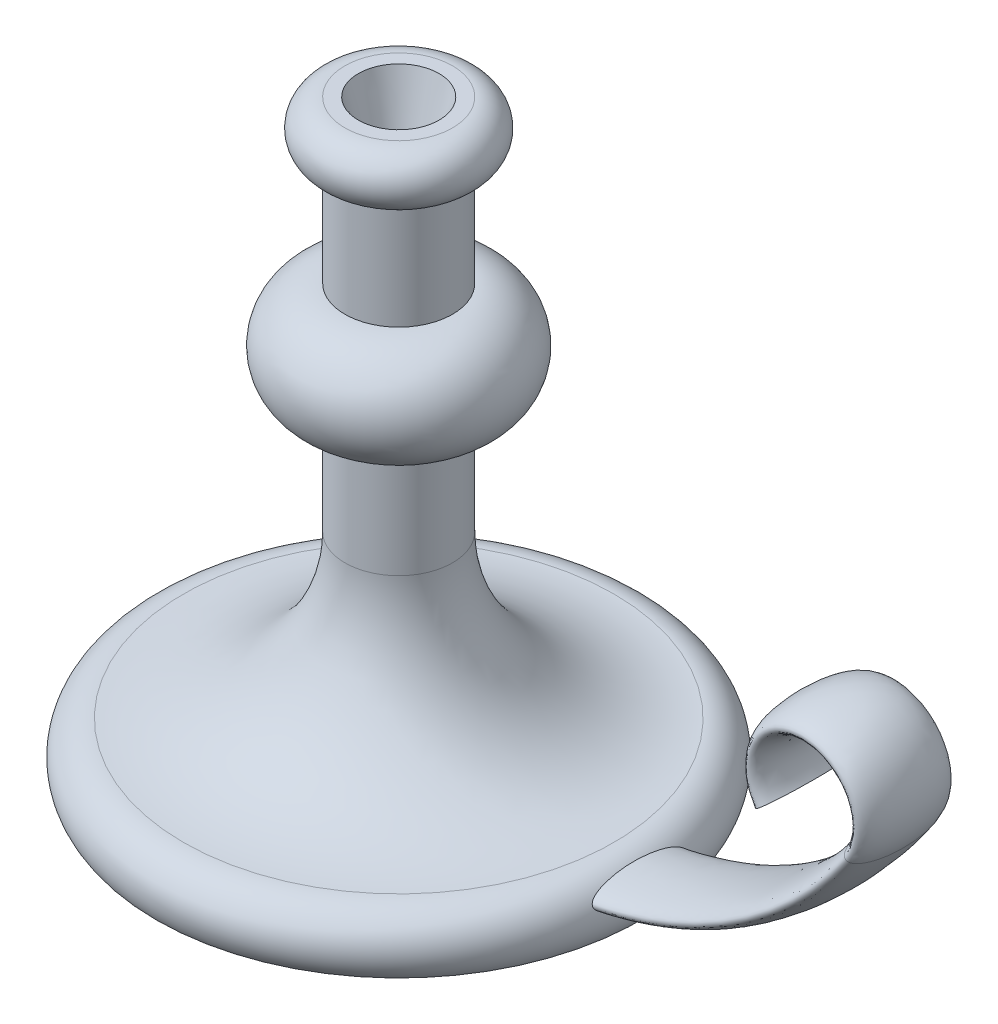
ISO-10303-21;
HEADER;
FILE_DESCRIPTION(('STEP AP214'),'2;1');
FILE_NAME('part.step','',(''),(''),'','','');
FILE_SCHEMA(('AUTOMOTIVE_DESIGN { 1 0 10303 214 1 1 1 1 }'));
ENDSEC;
DATA;
#1=APPLICATION_CONTEXT('core data for automotive mechanical design processes');
#2=APPLICATION_PROTOCOL_DEFINITION('international standard','automotive_design',2000,#1);
#3=PRODUCT_CONTEXT('',#1,'mechanical');
#4=PRODUCT('Part','Part','',(#3));
#5=PRODUCT_RELATED_PRODUCT_CATEGORY('part','',(#4));
#6=PRODUCT_DEFINITION_FORMATION('','',#4);
#7=PRODUCT_DEFINITION_CONTEXT('part definition',#1,'design');
#8=PRODUCT_DEFINITION('design','',#6,#7);
#9=PRODUCT_DEFINITION_SHAPE('','',#8);
#10=(LENGTH_UNIT() NAMED_UNIT(*) SI_UNIT(.MILLI.,.METRE.));
#11=(NAMED_UNIT(*) PLANE_ANGLE_UNIT() SI_UNIT($,.RADIAN.));
#12=(NAMED_UNIT(*) SI_UNIT($,.STERADIAN.) SOLID_ANGLE_UNIT());
#13=UNCERTAINTY_MEASURE_WITH_UNIT(LENGTH_MEASURE(1.E-05),#10,'distance_accuracy_value','');
#14=(GEOMETRIC_REPRESENTATION_CONTEXT(3) GLOBAL_UNCERTAINTY_ASSIGNED_CONTEXT((#13)) GLOBAL_UNIT_ASSIGNED_CONTEXT((#10,
#11,#12)) REPRESENTATION_CONTEXT('',''));
#15=CARTESIAN_POINT('',(0.,0.,0.));
#16=DIRECTION('',(0.,0.,1.));
#17=DIRECTION('',(1.,0.,0.));
#18=AXIS2_PLACEMENT_3D('',#15,#16,#17);
#19=CARTESIAN_POINT('',(0.,0.,0.));
#20=DIRECTION('',(0.,-1.,0.));
#21=DIRECTION('',(0.,0.,-1.));
#22=AXIS2_PLACEMENT_3D('',#19,#20,#21);
#23=PLANE('',#22);
#24=CARTESIAN_POINT('',(0.,0.,0.));
#25=DIRECTION('',(0.,-1.,0.));
#26=DIRECTION('',(0.,0.,-1.));
#27=AXIS2_PLACEMENT_3D('',#24,#25,#26);
#28=CIRCLE('',#27,90.);
#29=CARTESIAN_POINT('',(0.,0.,-90.));
#30=VERTEX_POINT('',#29);
#31=EDGE_CURVE('E76',#30,#30,#28,.T.);
#32=ORIENTED_EDGE('',*,*,#31,.T.);
#33=EDGE_LOOP('',(#32));
#34=FACE_BOUND('',#33,.T.);
#35=ADVANCED_FACE('F36',(#34),#23,.T.);
#36=CARTESIAN_POINT('',(0.,220.,0.));
#37=DIRECTION('',(0.,1.,0.));
#38=DIRECTION('',(0.,0.,1.));
#39=AXIS2_PLACEMENT_3D('',#36,#37,#38);
#40=PLANE('',#39);
#41=CARTESIAN_POINT('',(0.,220.,0.));
#42=DIRECTION('',(0.,1.,0.));
#43=DIRECTION('',(0.,0.,1.));
#44=AXIS2_PLACEMENT_3D('',#41,#42,#43);
#45=CIRCLE('',#44,15.);
#46=CARTESIAN_POINT('',(0.,220.,15.));
#47=VERTEX_POINT('',#46);
#48=EDGE_CURVE('E92',#47,#47,#45,.T.);
#49=ORIENTED_EDGE('',*,*,#48,.F.);
#50=EDGE_LOOP('',(#49));
#51=FACE_BOUND('',#50,.T.);
#52=CARTESIAN_POINT('',(0.,220.,0.));
#53=DIRECTION('',(0.,-1.,0.));
#54=DIRECTION('',(0.,0.,-1.));
#55=AXIS2_PLACEMENT_3D('',#52,#53,#54);
#56=CIRCLE('',#55,20.);
#57=CARTESIAN_POINT('',(0.,220.,-20.));
#58=VERTEX_POINT('',#57);
#59=EDGE_CURVE('E48',#58,#58,#56,.T.);
#60=ORIENTED_EDGE('',*,*,#59,.F.);
#61=EDGE_LOOP('',(#60));
#62=FACE_BOUND('',#61,.T.);
#63=ADVANCED_FACE('F99',(#51,#62),#40,.T.);
#64=CARTESIAN_POINT('',(0.,210.,0.));
#65=DIRECTION('',(0.,-1.,0.));
#66=DIRECTION('',(0.,0.,-1.));
#67=AXIS2_PLACEMENT_3D('',#64,#65,#66);
#68=TOROIDAL_SURFACE('',#67,20.,10.);
#69=ORIENTED_EDGE('',*,*,#59,.T.);
#70=EDGE_LOOP('',(#69));
#71=FACE_BOUND('',#70,.T.);
#72=CARTESIAN_POINT('',(0.,200.,0.));
#73=DIRECTION('',(0.,-1.,0.));
#74=DIRECTION('',(0.,0.,-1.));
#75=AXIS2_PLACEMENT_3D('',#72,#73,#74);
#76=CIRCLE('',#75,20.);
#77=CARTESIAN_POINT('',(0.,200.,-20.));
#78=VERTEX_POINT('',#77);
#79=EDGE_CURVE('E53',#78,#78,#76,.T.);
#80=ORIENTED_EDGE('',*,*,#79,.F.);
#81=EDGE_LOOP('',(#80));
#82=FACE_BOUND('',#81,.T.);
#83=ADVANCED_FACE('F102',(#71,#82),#68,.T.);
#84=CARTESIAN_POINT('',(0.,0.,0.));
#85=DIRECTION('',(0.,-1.,0.));
#86=DIRECTION('',(0.,0.,-1.));
#87=AXIS2_PLACEMENT_3D('',#84,#85,#86);
#88=CYLINDRICAL_SURFACE('',#87,20.);
#89=ORIENTED_EDGE('',*,*,#79,.T.);
#90=EDGE_LOOP('',(#89));
#91=FACE_BOUND('',#90,.T.);
#92=CARTESIAN_POINT('',(0.,160.,0.));
#93=DIRECTION('',(0.,-1.,0.));
#94=DIRECTION('',(0.,0.,-1.));
#95=AXIS2_PLACEMENT_3D('',#92,#93,#94);
#96=CIRCLE('',#95,20.);
#97=CARTESIAN_POINT('',(0.,160.,-20.));
#98=VERTEX_POINT('',#97);
#99=EDGE_CURVE('E58',#98,#98,#96,.T.);
#100=ORIENTED_EDGE('',*,*,#99,.F.);
#101=EDGE_LOOP('',(#100));
#102=FACE_BOUND('',#101,.T.);
#103=ADVANCED_FACE('F107',(#91,#102),#88,.T.);
#104=CARTESIAN_POINT('',(0.,140.,0.));
#105=DIRECTION('',(0.,-1.,0.));
#106=DIRECTION('',(0.,0.,-1.));
#107=AXIS2_PLACEMENT_3D('',#104,#105,#106);
#108=DEGENERATE_TOROIDAL_SURFACE('',#107,20.,20.,.T.);
#109=ORIENTED_EDGE('',*,*,#99,.T.);
#110=EDGE_LOOP('',(#109));
#111=FACE_BOUND('',#110,.T.);
#112=CARTESIAN_POINT('',(0.,120.,0.));
#113=DIRECTION('',(0.,-1.,0.));
#114=DIRECTION('',(0.,0.,-1.));
#115=AXIS2_PLACEMENT_3D('',#112,#113,#114);
#116=CIRCLE('',#115,20.);
#117=CARTESIAN_POINT('',(0.,120.,-20.));
#118=VERTEX_POINT('',#117);
#119=EDGE_CURVE('E64',#118,#118,#116,.T.);
#120=ORIENTED_EDGE('',*,*,#119,.F.);
#121=EDGE_LOOP('',(#120));
#122=FACE_BOUND('',#121,.T.);
#123=ADVANCED_FACE('F113',(#111,#122),#108,.T.);
#124=CARTESIAN_POINT('',(0.,0.,0.));
#125=DIRECTION('',(0.,-1.,0.));
#126=DIRECTION('',(0.,0.,-1.));
#127=AXIS2_PLACEMENT_3D('',#124,#125,#126);
#128=CYLINDRICAL_SURFACE('',#127,20.);
#129=ORIENTED_EDGE('',*,*,#119,.T.);
#130=EDGE_LOOP('',(#129));
#131=FACE_BOUND('',#130,.T.);
#132=CARTESIAN_POINT('',(0.,79.9999999999999,0.));
#133=DIRECTION('',(0.,-1.,0.));
#134=DIRECTION('',(0.,0.,-1.));
#135=AXIS2_PLACEMENT_3D('',#132,#133,#134);
#136=CIRCLE('',#135,20.);
#137=CARTESIAN_POINT('',(0.,79.9999999999999,-20.));
#138=VERTEX_POINT('',#137);
#139=EDGE_CURVE('E68',#138,#138,#136,.T.);
#140=ORIENTED_EDGE('',*,*,#139,.F.);
#141=EDGE_LOOP('',(#140));
#142=FACE_BOUND('',#141,.T.);
#143=ADVANCED_FACE('F117',(#131,#142),#128,.T.);
#144=CARTESIAN_POINT('',(0.,80.,0.));
#145=DIRECTION('',(0.,-1.,0.));
#146=DIRECTION('',(0.,0.,-1.));
#147=AXIS2_PLACEMENT_3D('',#144,#145,#146);
#148=TOROIDAL_SURFACE('',#147,80.,60.);
#149=ORIENTED_EDGE('',*,*,#139,.T.);
#150=EDGE_LOOP('',(#149));
#151=FACE_BOUND('',#150,.T.);
#152=CARTESIAN_POINT('',(0.,20.,0.));
#153=DIRECTION('',(0.,-1.,0.));
#154=DIRECTION('',(0.,0.,-1.));
#155=AXIS2_PLACEMENT_3D('',#152,#153,#154);
#156=CIRCLE('',#155,80.);
#157=CARTESIAN_POINT('',(0.,20.,-80.));
#158=VERTEX_POINT('',#157);
#159=EDGE_CURVE('E72',#158,#158,#156,.T.);
#160=ORIENTED_EDGE('',*,*,#159,.F.);
#161=EDGE_LOOP('',(#160));
#162=FACE_BOUND('',#161,.T.);
#163=ADVANCED_FACE('F121',(#151,#162),#148,.F.);
#164=CARTESIAN_POINT('',(0.,7.49999999999996,0.));
#165=DIRECTION('',(0.,-1.,0.));
#166=DIRECTION('',(0.,0.,-1.));
#167=AXIS2_PLACEMENT_3D('',#164,#165,#166);
#168=TOROIDAL_SURFACE('',#167,80.,12.5);
#169=CARTESIAN_POINT('',(89.5597422043341,12.9414346567555,17.5));
#170=CARTESIAN_POINT('',(89.5807278946485,12.8988393157081,17.5000019534777));
#171=CARTESIAN_POINT('',(89.6018125795403,12.8563039357769,17.4977816975197));
#172=CARTESIAN_POINT('',(89.6440155813562,12.771693833937,17.489002543543));
#173=CARTESIAN_POINT('',(89.6651339056646,12.7296192360718,17.4824425050804));
#174=CARTESIAN_POINT('',(89.7283289297819,12.6045076597417,17.4565216692095));
#175=CARTESIAN_POINT('',(89.7702246464785,12.5226255894255,17.4309204730636));
#176=CARTESIAN_POINT('',(89.8644276523311,12.3407735771966,17.3563532007827));
#177=CARTESIAN_POINT('',(89.9162117483189,12.242484901666,17.3027527423027));
#178=CARTESIAN_POINT('',(90.01638786814,12.0551458272008,17.178826321144));
#179=CARTESIAN_POINT('',(90.0647710548455,11.966119226993,17.1084587296403));
#180=CARTESIAN_POINT('',(90.1524531790237,11.8069845229249,16.9652391551481));
#181=CARTESIAN_POINT('',(90.1921458014335,11.7358878994478,16.8936963434585));
#182=CARTESIAN_POINT('',(90.2690886261224,11.5996259068224,16.7438969488311));
#183=CARTESIAN_POINT('',(90.306336728002,11.5344656201532,16.665634722265));
#184=CARTESIAN_POINT('',(90.3786756485818,11.4092540815105,16.5039763875564));
#185=CARTESIAN_POINT('',(90.4137624747614,11.349212210629,16.4205713158719));
#186=CARTESIAN_POINT('',(90.481945016647,11.2336894025401,16.2499454917114));
#187=CARTESIAN_POINT('',(90.5150413047901,11.1782071523834,16.162725848809));
#188=CARTESIAN_POINT('',(90.58397059301,11.0637251825689,15.9728919395736));
#189=CARTESIAN_POINT('',(90.6195406839562,11.0053156128849,15.8698282905887));
#190=CARTESIAN_POINT('',(90.6886668526269,10.8929143897208,15.6606649910658));
#191=CARTESIAN_POINT('',(90.7222226971281,10.8389232475745,15.5545649910506));
#192=CARTESIAN_POINT('',(90.7874864861339,10.7348751403118,15.3401290691865));
#193=CARTESIAN_POINT('',(90.8191972688173,10.6848120890841,15.2317969483067));
#194=CARTESIAN_POINT('',(90.8810059629789,10.5880683385414,15.0131968985225));
#195=CARTESIAN_POINT('',(90.9111039714556,10.5413874357516,14.9029290865686));
#196=CARTESIAN_POINT('',(90.9798973633519,10.4355491517098,14.6427529331226));
#197=CARTESIAN_POINT('',(91.0180072010883,10.377593665576,14.492201207548));
#198=CARTESIAN_POINT('',(91.0918875553169,10.2663462891691,14.1888070722871));
#199=CARTESIAN_POINT('',(91.1276577411367,10.2130550577558,14.0359643425397));
#200=CARTESIAN_POINT('',(91.1971197458645,10.1105127689612,13.7282685712581));
#201=CARTESIAN_POINT('',(91.2308091946811,10.0612662985098,13.573413471871));
#202=CARTESIAN_POINT('',(91.2962483962877,9.96642044574796,13.2621801041719));
#203=CARTESIAN_POINT('',(91.3279980241888,9.92082129819989,13.1058017385396));
#204=CARTESIAN_POINT('',(91.4205951755327,9.78887458660794,12.6346162266684));
#205=CARTESIAN_POINT('',(91.478758906098,9.70742476979591,12.3179025042441));
#206=CARTESIAN_POINT('',(91.5890957852253,9.55493826130148,11.6792188898601));
#207=CARTESIAN_POINT('',(91.6412365063819,9.48395741425902,11.3572303186109));
#208=CARTESIAN_POINT('',(91.7397682682944,9.35136221163194,10.7107316640822));
#209=CARTESIAN_POINT('',(91.7861636672356,9.28974074823242,10.3862236929833));
#210=CARTESIAN_POINT('',(91.873697660451,9.17463718318048,9.73512886653558));
#211=CARTESIAN_POINT('',(91.9148370779326,9.12115380666531,9.40854234516803));
#212=CARTESIAN_POINT('',(91.9930777751441,9.02031209920313,8.746303399126));
#213=CARTESIAN_POINT('',(92.0300669877612,8.97311921137155,8.41061269264324));
#214=CARTESIAN_POINT('',(92.0991833927575,8.88559842477431,7.73783252743932));
#215=CARTESIAN_POINT('',(92.1313104056235,8.84527077946748,7.40074301754598));
#216=CARTESIAN_POINT('',(92.1909161961865,8.77092313439266,6.72537142355332));
#217=CARTESIAN_POINT('',(92.2183937480205,8.7369047978918,6.38708904887178));
#218=CARTESIAN_POINT('',(92.2688480816039,8.67476840304499,5.70964427774276));
#219=CARTESIAN_POINT('',(92.2918247141674,8.64665054027191,5.37048185250285));
#220=CARTESIAN_POINT('',(92.3540877228586,8.57076604630485,4.35367181244654));
#221=CARTESIAN_POINT('',(92.3868571977358,8.53128338370552,3.67498389641632));
#222=CARTESIAN_POINT('',(92.4356134743347,8.47274161832893,2.31614711504055));
#223=CARTESIAN_POINT('',(92.4515998737813,8.45368300509714,1.63599821506809));
#224=CARTESIAN_POINT('',(92.4661200478781,8.43637339284853,0.357955102331816));
#225=CARTESIAN_POINT('',(92.4665389208555,8.43587490179706,-0.239888856143766));
#226=CARTESIAN_POINT('',(92.4546362797528,8.45006241260828,-1.43536153859171));
#227=CARTESIAN_POINT('',(92.4423128974782,8.46475064105844,-2.03299021814847));
#228=CARTESIAN_POINT('',(92.4047541650815,8.50976680779928,-3.22745109478545));
#229=CARTESIAN_POINT('',(92.3795147316879,8.54009969200436,-3.82428298010723));
#230=CARTESIAN_POINT('',(92.3157217367252,8.61743320229674,-5.01694606233256));
#231=CARTESIAN_POINT('',(92.2771508465327,8.66445552395917,-5.61277493756124));
#232=CARTESIAN_POINT('',(92.1861026743767,8.77678784246253,-6.8015388638093));
#233=CARTESIAN_POINT('',(92.1336290020919,8.84209309262497,-7.39447462535079));
#234=CARTESIAN_POINT('',(92.0437550848418,8.95574227206708,-8.28055229820499));
#235=CARTESIAN_POINT('',(92.0119455213755,8.9962289455201,-8.57528682166712));
#236=CARTESIAN_POINT('',(91.9444204496405,9.08291539794885,-9.16346094428868));
#237=CARTESIAN_POINT('',(91.9087051114865,9.12911492811455,-9.45690059926697));
#238=CARTESIAN_POINT('',(91.8331309715697,9.22782929334064,-10.0422906036681));
#239=CARTESIAN_POINT('',(91.7932707518514,9.28034629056378,-10.3342404073466));
#240=CARTESIAN_POINT('',(91.7091179167369,9.39245062081624,-10.916185281105));
#241=CARTESIAN_POINT('',(91.6648247441272,9.45203884286023,-11.206180100545));
#242=CARTESIAN_POINT('',(91.571392572748,9.57931645333872,-11.7838191658166));
#243=CARTESIAN_POINT('',(91.5222504482681,9.64701107336917,-12.071461764307));
#244=CARTESIAN_POINT('',(91.4186796874406,9.79172730085897,-12.6430805537629));
#245=CARTESIAN_POINT('',(91.3642572573635,9.86873798424086,-12.9270606150352));
#246=CARTESIAN_POINT('',(91.2493765391175,10.0339529747879,-13.4904217181463));
#247=CARTESIAN_POINT('',(91.1889212109097,10.1221517983453,-13.7698049377445));
#248=CARTESIAN_POINT('',(91.0929373870874,10.2648274882362,-14.1839125047643));
#249=CARTESIAN_POINT('',(91.0600757486262,10.3140904181848,-14.3210581267383));
#250=CARTESIAN_POINT('',(90.9923938569386,10.416551102719,-14.5933763477646));
#251=CARTESIAN_POINT('',(90.9575737807137,10.4697485018482,-14.7285491237341));
#252=CARTESIAN_POINT('',(90.8810851838777,10.5878451344078,-15.0138774923675));
#253=CARTESIAN_POINT('',(90.8391147723957,10.6533666208411,-15.1636969104746));
#254=CARTESIAN_POINT('',(90.7519625692611,10.7912189771814,-15.4593295355898));
#255=CARTESIAN_POINT('',(90.7067794219568,10.8635527258307,-15.6051410149848));
#256=CARTESIAN_POINT('',(90.6128939496974,11.0160439629676,-15.8905749729622));
#257=CARTESIAN_POINT('',(90.564208454431,11.0961646105685,-16.0302224467125));
#258=CARTESIAN_POINT('',(90.4624897667352,11.2662530107873,-16.3016394850687));
#259=CARTESIAN_POINT('',(90.4094613083906,11.3562100760681,-16.4334173639364));
#260=CARTESIAN_POINT('',(90.3114276481004,11.5255085385048,-16.655310813896));
#261=CARTESIAN_POINT('',(90.2675273757816,11.6022608890606,-16.7478644471361));
#262=CARTESIAN_POINT('',(90.1761749534326,11.7643292238687,-16.9236630994732));
#263=CARTESIAN_POINT('',(90.1287172073378,11.849658775493,-17.0068929161981));
#264=CARTESIAN_POINT('',(90.0292807633426,12.0313291797368,-17.160728121925));
#265=CARTESIAN_POINT('',(89.9772518064337,12.1277974407354,-17.2311575389091));
#266=CARTESIAN_POINT('',(89.8965437818878,12.2800613987941,-17.3212876850735));
#267=CARTESIAN_POINT('',(89.8692277989252,12.3320164153136,-17.3487242132161));
#268=CARTESIAN_POINT('',(89.8138320311431,12.4382955168477,-17.3975211145679));
#269=CARTESIAN_POINT('',(89.7857527202502,12.4926181439797,-17.418885167671));
#270=CARTESIAN_POINT('',(89.7185869780336,12.6237048005597,-17.4611772226903));
#271=CARTESIAN_POINT('',(89.6792533408886,12.7013692224275,-17.4790502108363));
#272=CARTESIAN_POINT('',(89.6005512815564,12.8586256339484,-17.4997317533412));
#273=CARTESIAN_POINT('',(89.5611829132233,12.9382160139948,-17.5025524785485));
#274=CARTESIAN_POINT('',(89.4835317885697,13.0969633423243,-17.4927372657774));
#275=CARTESIAN_POINT('',(89.4452490812937,13.1761202708963,-17.4801006306501));
#276=CARTESIAN_POINT('',(89.3707047667355,13.3318071774562,-17.440649407729));
#277=CARTESIAN_POINT('',(89.3344452993771,13.408334342353,-17.413820111618));
#278=CARTESIAN_POINT('',(89.2510611220234,13.5858554385681,-17.3357126521073));
#279=CARTESIAN_POINT('',(89.2050998650831,13.6849823777219,-17.2790047620842));
#280=CARTESIAN_POINT('',(89.1180744174556,13.8744276311818,-17.1491670423828));
#281=CARTESIAN_POINT('',(89.0770301058259,13.9647099356685,-17.0759737821299));
#282=CARTESIAN_POINT('',(89.0037033744712,14.1271434857569,-16.9270577307041));
#283=CARTESIAN_POINT('',(88.9709541551904,14.2001945680731,-16.8525208708988));
#284=CARTESIAN_POINT('',(88.908496842619,14.3401811690447,-16.6970292692112));
#285=CARTESIAN_POINT('',(88.8787841266134,14.4071259665767,-16.6160846261895));
#286=CARTESIAN_POINT('',(88.8217814388549,14.5359995630881,-16.4490709627681));
#287=CARTESIAN_POINT('',(88.7944998605827,14.597910924241,-16.3629857823213));
#288=CARTESIAN_POINT('',(88.7420667437369,14.7171734064658,-16.1870697873634));
#289=CARTESIAN_POINT('',(88.7169159331092,14.7745229686599,-16.0972377082954));
#290=CARTESIAN_POINT('',(88.6682699235336,14.885589909051,-15.9140699306466));
#291=CARTESIAN_POINT('',(88.6447869137156,14.9392804489424,-15.8207148279063));
#292=CARTESIAN_POINT('',(88.5993971939428,15.043100884388,-15.6316626961437));
#293=CARTESIAN_POINT('',(88.5774907604158,15.09323015551,-15.5359652603529));
#294=CARTESIAN_POINT('',(88.513751478622,15.2390285874184,-15.2458062448792));
#295=CARTESIAN_POINT('',(88.4739596847914,15.3299685477357,-15.0485147207853));
#296=CARTESIAN_POINT('',(88.3985337506615,15.5017775203623,-14.6487152633395));
#297=CARTESIAN_POINT('',(88.362902963484,15.5826384140038,-14.4462032813481));
#298=CARTESIAN_POINT('',(88.2948356711212,15.7363066128669,-14.0365764701698));
#299=CARTESIAN_POINT('',(88.262414229517,15.8090761199813,-13.8294450545358));
#300=CARTESIAN_POINT('',(88.2003835751382,15.9473648801954,-13.412628987177));
#301=CARTESIAN_POINT('',(88.1707714189814,16.0128917338219,-13.2029472733592));
#302=CARTESIAN_POINT('',(88.1139049361938,16.1377375745618,-12.7814949946311));
#303=CARTESIAN_POINT('',(88.0866500408509,16.1970580597501,-12.5697249473639));
#304=CARTESIAN_POINT('',(88.027617257203,16.3244235662302,-12.0912931700789));
#305=CARTESIAN_POINT('',(87.9964138193045,16.3909381265492,-11.8241540502356));
#306=CARTESIAN_POINT('',(87.9367717636618,16.5165936764717,-11.2878278414661));
#307=CARTESIAN_POINT('',(87.9083334164422,16.5757339447658,-11.0186405549286));
#308=CARTESIAN_POINT('',(87.8539266282972,16.6875098948954,-10.4785408424895));
#309=CARTESIAN_POINT('',(87.8279593730488,16.7401424577993,-10.2076276543206));
#310=CARTESIAN_POINT('',(87.7783184309332,16.8395301522934,-9.66451167999967));
#311=CARTESIAN_POINT('',(87.7546448506397,16.8862850108115,-9.39230883454067));
#312=CARTESIAN_POINT('',(87.6869994555325,17.0182803050946,-8.57578965921945));
#313=CARTESIAN_POINT('',(87.6462388525847,17.0955854003685,-8.02991167225619));
#314=CARTESIAN_POINT('',(87.5728065515612,17.23201456873,-6.93552385094183));
#315=CARTESIAN_POINT('',(87.5401330675683,17.2911426566326,-6.3870146249828));
#316=CARTESIAN_POINT('',(87.4828441952972,17.3930876120973,-5.28955884851112));
#317=CARTESIAN_POINT('',(87.4582074588681,17.4359477429321,-4.74061740412774));
#318=CARTESIAN_POINT('',(87.4169410999172,17.50688849347,-3.64146108218982));
#319=CARTESIAN_POINT('',(87.4003119088602,17.5349683167838,-3.09124613762084));
#320=CARTESIAN_POINT('',(87.3751699481989,17.5771566462024,-1.98980868969534));
#321=CARTESIAN_POINT('',(87.3666614689743,17.5912577671531,-1.43858580772457));
#322=CARTESIAN_POINT('',(87.3578539704595,17.6058511840595,-0.335909067649103));
#323=CARTESIAN_POINT('',(87.3575547550006,17.6063438052041,0.215544784621421));
#324=CARTESIAN_POINT('',(87.3651677510507,17.5937352162513,1.3181582277583));
#325=CARTESIAN_POINT('',(87.3730787250642,17.5806360547997,1.8693178504467));
#326=CARTESIAN_POINT('',(87.3970372477741,17.5404868292748,2.97097544677278));
#327=CARTESIAN_POINT('',(87.4130850653535,17.5134363041762,3.52147339794282));
#328=CARTESIAN_POINT('',(87.4531996813079,17.4446213827579,4.62112135666314));
#329=CARTESIAN_POINT('',(87.4772644593789,17.4028606933023,5.17027166873655));
#330=CARTESIAN_POINT('',(87.5333316774057,17.3033707612736,6.26670053623024));
#331=CARTESIAN_POINT('',(87.5653334299477,17.2456429015521,6.81397924958864));
#332=CARTESIAN_POINT('',(87.6208220531227,17.142904950909,7.6550332138325));
#333=CARTESIAN_POINT('',(87.6414679669256,17.1042333246747,7.94978028808391));
#334=CARTESIAN_POINT('',(87.6851649593452,17.021225070156,8.53829462761757));
#335=CARTESIAN_POINT('',(87.7082159678746,16.9768886069434,8.83206192119447));
#336=CARTESIAN_POINT('',(87.7568106691333,16.8820510369686,9.41827197236467));
#337=CARTESIAN_POINT('',(87.7823533405997,16.8315524537752,9.71071522164429));
#338=CARTESIAN_POINT('',(87.8360989952261,16.7237193681056,10.2940938312713));
#339=CARTESIAN_POINT('',(87.8643018909552,16.6663850902748,10.585029240844));
#340=CARTESIAN_POINT('',(87.9147712499543,16.5622842610511,11.0784529887191));
#341=CARTESIAN_POINT('',(87.936298025295,16.5174691899797,11.2814293835303));
#342=CARTESIAN_POINT('',(87.98091183013,16.4236835134758,11.6862455623046));
#343=CARTESIAN_POINT('',(88.0039988123349,16.374713033981,11.8880853805162));
#344=CARTESIAN_POINT('',(88.0519198244939,16.2721215384767,12.2905621648816));
#345=CARTESIAN_POINT('',(88.076755333732,16.2184965755437,12.4911979528386));
#346=CARTESIAN_POINT('',(88.1283787004663,16.1060707847346,12.8907612736812));
#347=CARTESIAN_POINT('',(88.1551664933019,16.0472701282671,13.0896888628995));
#348=CARTESIAN_POINT('',(88.21099997805,15.9237718205584,13.4854201231387));
#349=CARTESIAN_POINT('',(88.2400459194854,15.8590735174972,13.6822235566987));
#350=CARTESIAN_POINT('',(88.3008027999429,15.722869193586,14.0730419872875));
#351=CARTESIAN_POINT('',(88.332513477958,15.6513638393852,14.267057255238));
#352=CARTESIAN_POINT('',(88.3991424541956,15.5003948115867,14.6511973591117));
#353=CARTESIAN_POINT('',(88.4340575115812,15.4209391715434,14.8413258930642));
#354=CARTESIAN_POINT('',(88.5079196083044,15.2523848762573,15.2164401400152));
#355=CARTESIAN_POINT('',(88.5468648114125,15.1632906117658,15.4014281468474));
#356=CARTESIAN_POINT('',(88.6092096238847,15.0206579718878,15.6733114229628));
#357=CARTESIAN_POINT('',(88.6306485895097,14.9716086740032,15.7630166800357));
#358=CARTESIAN_POINT('',(88.6750422753308,14.8701248615228,15.9401002079361));
#359=CARTESIAN_POINT('',(88.6979967332493,14.8176909327205,16.0274788777588));
#360=CARTESIAN_POINT('',(88.7456840101796,14.708947884428,16.1993887567124));
#361=CARTESIAN_POINT('',(88.7704179688267,14.6526362825897,16.2839180892535));
#362=CARTESIAN_POINT('',(88.8219484857476,14.5356422617909,16.4492391224747));
#363=CARTESIAN_POINT('',(88.8487445345045,14.4749609227749,16.5300317386025));
#364=CARTESIAN_POINT('',(88.8976102788185,14.3647434848953,16.6667168433045));
#365=CARTESIAN_POINT('',(88.9191374191608,14.3163230322084,16.723695533494));
#366=CARTESIAN_POINT('',(88.9637080676466,14.2164452982162,16.8342912802669));
#367=CARTESIAN_POINT('',(88.9867519478511,14.1649872721067,16.8879075056812));
#368=CARTESIAN_POINT('',(89.0583610181498,14.0058008216802,17.0423310846551));
#369=CARTESIAN_POINT('',(89.1095289234102,13.8929758416962,17.137079610972));
#370=CARTESIAN_POINT('',(89.1999001554572,13.696338620898,17.2707956184661));
#371=CARTESIAN_POINT('',(89.2367505169319,13.6167644879688,17.3175503480627));
#372=CARTESIAN_POINT('',(89.3136877653848,13.4522974166017,17.3968468737184));
#373=CARTESIAN_POINT('',(89.3537667767864,13.3674175273971,17.4294220837179));
#374=CARTESIAN_POINT('',(89.4217091217891,13.2251848973546,17.4685967336682));
#375=CARTESIAN_POINT('',(89.4488093840978,13.168855171618,17.4803204652975));
#376=CARTESIAN_POINT('',(89.5037947740348,13.0554594934973,17.4960211898048));
#377=CARTESIAN_POINT('',(89.5316799818999,12.9983934661742,17.499997387795));
#378=CARTESIAN_POINT('',(89.5597422043341,12.9414346567555,17.5));
#379=B_SPLINE_CURVE_WITH_KNOTS('',3,(#169,#170,#171,#172,#173,#174,#175,#176,#177,#178,#179,
#180,#181,#182,#183,#184,#185,#186,#187,#188,#189,#190,#191,#192,#193,#194,#195,#196,#197,#198,
#199,#200,#201,#202,#203,#204,#205,#206,#207,#208,#209,#210,#211,#212,#213,#214,#215,#216,#217,
#218,#219,#220,#221,#222,#223,#224,#225,#226,#227,#228,#229,#230,#231,#232,#233,#234,#235,#236,
#237,#238,#239,#240,#241,#242,#243,#244,#245,#246,#247,#248,#249,#250,#251,#252,#253,#254,#255,
#256,#257,#258,#259,#260,#261,#262,#263,#264,#265,#266,#267,#268,#269,#270,#271,#272,#273,#274,
#275,#276,#277,#278,#279,#280,#281,#282,#283,#284,#285,#286,#287,#288,#289,#290,#291,#292,#293,
#294,#295,#296,#297,#298,#299,#300,#301,#302,#303,#304,#305,#306,#307,#308,#309,#310,#311,#312,
#313,#314,#315,#316,#317,#318,#319,#320,#321,#322,#323,#324,#325,#326,#327,#328,#329,#330,#331,
#332,#333,#334,#335,#336,#337,#338,#339,#340,#341,#342,#343,#344,#345,#346,#347,#348,#349,#350,
#351,#352,#353,#354,#355,#356,#357,#358,#359,#360,#361,#362,#363,#364,#365,#366,#367,#368,#369,
#370,#371,#372,#373,#374,#375,#376,#377,#378),.UNSPECIFIED.,.T.,.F.,(4,2,2,2,2,2,2,2,2,2,2,2,2,
2,2,2,2,2,2,2,2,2,2,2,2,2,2,2,2,2,2,2,2,2,2,2,2,2,2,2,2,2,2,2,2,2,2,2,2,2,2,2,2,2,2,2,2,2,2,2,2,
2,2,2,2,2,2,2,2,2,2,2,2,2,2,2,2,2,2,2,2,2,2,2,2,2,2,2,2,2,2,2,2,2,2,2,2,2,2,2,2,2,2,2,4),(0.,
0.142381357158824,0.284800145338815,0.569778369710414,0.937790990160528,1.30672699797603,
1.63143353328553,1.95641550824171,2.28198085179476,2.60745211744531,2.97835758825748,
3.34930592253144,3.71966767593577,4.09000712931068,4.58717127025781,5.08440552627609,
5.58219609730427,6.08001868322212,7.07612740491157,8.07737111401427,9.0778506032849,
10.0781732018631,11.1010679437464,12.1240004418371,13.1472022244409,14.1704379160045,
16.2117115539476,18.2530341182274,20.046245769242,21.8397203676841,23.6337623045226,
25.4301450150664,27.2260617741973,28.1235892294176,29.0210776087002,29.9188740333845,
30.8167834514319,31.7152755049918,32.6127240115715,33.5097343419001,33.9578247270812,
34.4058746792325,34.9121604747936,35.4186611861168,35.9228725276492,36.426541383562,
36.8100240505596,37.1941231504199,37.5831580539592,37.7772586450041,37.9712413599167,
38.2366258142316,38.5017956533799,38.7669774525069,39.0324346081147,39.3996555983547,
39.7683144393119,40.0959866375238,40.4231523204126,40.751406998221,41.0797733710074,
41.4103344436375,41.7409533344648,42.4030339566265,43.0656444835725,43.7312306850942,
44.3961116446145,45.0608317450492,45.8918608553066,46.7229711882486,47.5544783139741,
48.3860240564133,50.0440426041155,51.7016946762988,53.3549069476159,55.0082082878421,
56.6623826267301,58.3165174374142,59.9704029618881,61.6243431428159,63.2778668395587,
64.9312473761618,65.8251617717361,66.7190501248651,67.6125736254173,68.5060677696803,
69.1329546330635,69.7598225042265,70.3872272415065,71.0146112082189,71.6420645989491,
72.2694566030637,72.8962209263431,73.5227009279498,73.8360175198378,74.1492800292287,
74.4627449766586,74.7761327179486,75.0094189443185,75.2427626113336,75.7080186392211,
76.0052441465106,76.3017654013235,76.4921392885516,76.6825327068869),.UNSPECIFIED.);
#380=CARTESIAN_POINT('',(89.5597422043341,12.9414346567555,17.5));
#381=VERTEX_POINT('',#380);
#382=EDGE_CURVE('E10',#381,#381,#379,.T.);
#383=ORIENTED_EDGE('',*,*,#382,.F.);
#384=EDGE_LOOP('',(#383));
#385=FACE_BOUND('',#384,.T.);
#386=ORIENTED_EDGE('',*,*,#159,.T.);
#387=EDGE_LOOP('',(#386));
#388=FACE_BOUND('',#387,.T.);
#389=ORIENTED_EDGE('',*,*,#31,.F.);
#390=EDGE_LOOP('',(#389));
#391=FACE_BOUND('',#390,.T.);
#392=ADVANCED_FACE('F124',(#385,#388,#391),#168,.T.);
#393=CARTESIAN_POINT('',(150.634185358261,75.,0.));
#394=DIRECTION('',(0.566666666666666,-0.823947139620552,0.));
#395=DIRECTION('',(0.,0.,-1.));
#396=AXIS2_PLACEMENT_3D('',#393,#394,#395);
#397=PLANE('',#396);
#398=CARTESIAN_POINT('',(150.634185358261,75.,0.));
#399=DIRECTION('',(0.566666666666666,-0.823947139620552,0.));
#400=DIRECTION('',(0.,0.,1.));
#401=AXIS2_PLACEMENT_3D('',#398,#399,#400);
#402=ELLIPSE('',#401,17.5,5.);
#403=CARTESIAN_POINT('',(150.634185358261,75.,17.5));
#404=VERTEX_POINT('',#403);
#405=EDGE_CURVE('E80',#404,#404,#402,.T.);
#406=ORIENTED_EDGE('',*,*,#405,.T.);
#407=EDGE_LOOP('',(#406));
#408=FACE_BOUND('',#407,.T.);
#409=ADVANCED_FACE('F129',(#408),#397,.T.);
#410=CARTESIAN_POINT('',(60.,10.,17.5));
#411=CARTESIAN_POINT('',(110.410191303973,10.,17.5));
#412=CARTESIAN_POINT('',(155.026295870831,33.4646670673665,17.5));
#413=CARTESIAN_POINT('',(183.592070943083,75.,17.5));
#414=CARTESIAN_POINT('',(60.,0.,17.5));
#415=CARTESIAN_POINT('',(113.770870724238,0.,17.5));
#416=CARTESIAN_POINT('',(161.36138226222,25.0289782051909,17.5));
#417=CARTESIAN_POINT('',(191.831542339288,69.3333333333333,17.5));
#418=CARTESIAN_POINT('',(60.,0.,-17.5));
#419=CARTESIAN_POINT('',(113.770870724238,0.,-17.5));
#420=CARTESIAN_POINT('',(161.36138226222,25.0289782051909,-17.5));
#421=CARTESIAN_POINT('',(191.831542339288,69.3333333333333,-17.5));
#422=CARTESIAN_POINT('',(60.,10.,-17.5));
#423=CARTESIAN_POINT('',(110.410191303973,10.,-17.5));
#424=CARTESIAN_POINT('',(155.026295870831,33.4646670673665,-17.5));
#425=CARTESIAN_POINT('',(183.592070943083,75.,-17.5));
#426=CARTESIAN_POINT('',(60.,20.,-17.5));
#427=CARTESIAN_POINT('',(107.049511883708,20.,-17.5));
#428=CARTESIAN_POINT('',(148.691209479443,41.9003559295421,-17.5));
#429=CARTESIAN_POINT('',(175.352599546877,80.6666666666666,-17.5));
#430=CARTESIAN_POINT('',(60.,20.,17.5));
#431=CARTESIAN_POINT('',(107.049511883708,20.,17.5));
#432=CARTESIAN_POINT('',(148.691209479443,41.9003559295421,17.5));
#433=CARTESIAN_POINT('',(175.352599546877,80.6666666666666,17.5));
#434=CARTESIAN_POINT('',(60.,10.,17.5));
#435=CARTESIAN_POINT('',(110.410191303973,10.,17.5));
#436=CARTESIAN_POINT('',(155.026295870831,33.4646670673665,17.5));
#437=CARTESIAN_POINT('',(183.592070943083,75.,17.5));
#438=(BOUNDED_SURFACE() B_SPLINE_SURFACE(3,3,((#410,#411,#412,#413),(#414,#415,#416,#417),(#418,
#419,#420,#421),(#422,#423,#424,#425),(#426,#427,#428,#429),(#430,#431,#432,#433),(#434,#435,
#436,#437)),.UNSPECIFIED.,.T.,.F.,.F.) B_SPLINE_SURFACE_WITH_KNOTS((4,3,4),(4,4),(0.,0.5,1.),
(0.,1.),.UNSPECIFIED.) GEOMETRIC_REPRESENTATION_ITEM() RATIONAL_B_SPLINE_SURFACE(((1.,
0.923374135437856,0.923374135437856,1.),(0.333333333333333,0.307791378479285,0.307791378479285,
0.333333333333333),(0.333333333333333,0.307791378479285,0.307791378479285,0.333333333333333),
(1.,0.923374135437856,0.923374135437856,1.),(0.333333333333333,0.307791378479285,
0.307791378479285,0.333333333333333),(0.333333333333333,0.307791378479285,0.307791378479285,
0.333333333333333),(1.,0.923374135437856,0.923374135437856,1.))) REPRESENTATION_ITEM('') SURFACE());
#439=CARTESIAN_POINT('',(183.592070943083,75.,0.));
#440=DIRECTION('',(0.566666666666667,0.823947139620552,0.));
#441=DIRECTION('',(0.,0.,1.));
#442=AXIS2_PLACEMENT_3D('',#439,#440,#441);
#443=ELLIPSE('',#442,17.5,5.);
#444=CARTESIAN_POINT('',(183.592070943083,75.,17.5));
#445=VERTEX_POINT('',#444);
#446=EDGE_CURVE('E84',#445,#445,#443,.T.);
#447=ORIENTED_EDGE('',*,*,#382,.T.);
#448=EDGE_LOOP('',(#447));
#449=FACE_BOUND('',#448,.T.);
#450=ORIENTED_EDGE('',*,*,#446,.F.);
#451=EDGE_LOOP('',(#450));
#452=FACE_BOUND('',#451,.T.);
#453=ADVANCED_FACE('F134',(#449,#452),#438,.T.);
#454=CARTESIAN_POINT('',(183.592070943083,75.,17.5));
#455=CARTESIAN_POINT('',(193.981461744242,90.10642735238,17.5));
#456=CARTESIAN_POINT('',(185.447347211541,106.333333333333,17.5));
#457=CARTESIAN_POINT('',(167.113128150672,106.333333333333,17.5));
#458=CARTESIAN_POINT('',(148.778909089802,106.333333333333,17.5));
#459=CARTESIAN_POINT('',(140.244794557101,90.1064273523801,17.5));
#460=CARTESIAN_POINT('',(150.634185358261,75.,17.5));
#461=CARTESIAN_POINT('',(191.831542339288,69.3333333333333,17.5));
#462=CARTESIAN_POINT('',(207.415628541028,91.9929743619034,17.5));
#463=CARTESIAN_POINT('',(194.614456741976,116.333333333333,17.5));
#464=CARTESIAN_POINT('',(167.113128150672,116.333333333333,17.5));
#465=CARTESIAN_POINT('',(139.611799559367,116.333333333333,17.5));
#466=CARTESIAN_POINT('',(126.810627760316,91.9929743619035,17.5));
#467=CARTESIAN_POINT('',(142.394713962055,69.3333333333334,17.5));
#468=CARTESIAN_POINT('',(191.831542339288,69.3333333333333,-17.5));
#469=CARTESIAN_POINT('',(207.415628541028,91.9929743619034,-17.5));
#470=CARTESIAN_POINT('',(194.614456741976,116.333333333333,-17.5));
#471=CARTESIAN_POINT('',(167.113128150672,116.333333333333,-17.5));
#472=CARTESIAN_POINT('',(139.611799559367,116.333333333333,-17.5));
#473=CARTESIAN_POINT('',(126.810627760316,91.9929743619035,-17.5));
#474=CARTESIAN_POINT('',(142.394713962055,69.3333333333334,-17.5));
#475=CARTESIAN_POINT('',(183.592070943083,75.,-17.5));
#476=CARTESIAN_POINT('',(193.981461744242,90.10642735238,-17.5));
#477=CARTESIAN_POINT('',(185.447347211541,106.333333333333,-17.5));
#478=CARTESIAN_POINT('',(167.113128150672,106.333333333333,-17.5));
#479=CARTESIAN_POINT('',(148.778909089802,106.333333333333,-17.5));
#480=CARTESIAN_POINT('',(140.244794557101,90.1064273523801,-17.5));
#481=CARTESIAN_POINT('',(150.634185358261,75.,-17.5));
#482=CARTESIAN_POINT('',(175.352599546877,80.6666666666667,-17.5));
#483=CARTESIAN_POINT('',(180.547294947457,88.2198803428567,-17.5));
#484=CARTESIAN_POINT('',(176.280237681107,96.3333333333333,-17.5));
#485=CARTESIAN_POINT('',(167.113128150672,96.3333333333333,-17.5));
#486=CARTESIAN_POINT('',(157.946018620237,96.3333333333333,-17.5));
#487=CARTESIAN_POINT('',(153.678961353887,88.2198803428567,-17.5));
#488=CARTESIAN_POINT('',(158.873656754466,80.6666666666667,-17.5));
#489=CARTESIAN_POINT('',(175.352599546877,80.6666666666667,17.5));
#490=CARTESIAN_POINT('',(180.547294947457,88.2198803428567,17.5));
#491=CARTESIAN_POINT('',(176.280237681107,96.3333333333333,17.5));
#492=CARTESIAN_POINT('',(167.113128150672,96.3333333333333,17.5));
#493=CARTESIAN_POINT('',(157.946018620237,96.3333333333333,17.5));
#494=CARTESIAN_POINT('',(153.678961353887,88.2198803428567,17.5));
#495=CARTESIAN_POINT('',(158.873656754466,80.6666666666667,17.5));
#496=CARTESIAN_POINT('',(183.592070943083,75.,17.5));
#497=CARTESIAN_POINT('',(193.981461744242,90.10642735238,17.5));
#498=CARTESIAN_POINT('',(185.447347211541,106.333333333333,17.5));
#499=CARTESIAN_POINT('',(167.113128150672,106.333333333333,17.5));
#500=CARTESIAN_POINT('',(148.778909089802,106.333333333333,17.5));
#501=CARTESIAN_POINT('',(140.244794557101,90.1064273523801,17.5));
#502=CARTESIAN_POINT('',(150.634185358261,75.,17.5));
#503=(BOUNDED_SURFACE() B_SPLINE_SURFACE(3,3,((#454,#455,#456,#457,#458,#459,#460),(#461,#462,
#463,#464,#465,#466,#467),(#468,#469,#470,#471,#472,#473,#474),(#475,#476,#477,#478,#479,#480,
#481),(#482,#483,#484,#485,#486,#487,#488),(#489,#490,#491,#492,#493,#494,#495),(#496,#497,#498,
#499,#500,#501,#502)),.UNSPECIFIED.,.T.,.F.,.F.) B_SPLINE_SURFACE_WITH_KNOTS((4,3,4),(4,3,4),
(0.,0.5,1.),(0.,0.5,1.),
.UNSPECIFIED.) GEOMETRIC_REPRESENTATION_ITEM() RATIONAL_B_SPLINE_SURFACE(((1.,0.643649778750421,
0.643649778750421,1.,0.643649778750421,0.643649778750421,1.),(0.333333333333333,
0.21454992625014,0.21454992625014,0.333333333333333,0.21454992625014,0.21454992625014,
0.333333333333333),(0.333333333333333,0.21454992625014,0.21454992625014,0.333333333333333,
0.21454992625014,0.21454992625014,0.333333333333333),(1.,0.643649778750421,0.643649778750421,1.,
0.643649778750421,0.643649778750421,1.),(0.333333333333333,0.21454992625014,0.21454992625014,
0.333333333333333,0.21454992625014,0.21454992625014,0.333333333333333),(0.333333333333333,
0.21454992625014,0.21454992625014,0.333333333333333,0.21454992625014,0.21454992625014,
0.333333333333333),(1.,0.643649778750421,0.643649778750421,1.,0.643649778750421,
0.643649778750421,1.))) REPRESENTATION_ITEM('') SURFACE());
#504=ORIENTED_EDGE('',*,*,#405,.F.);
#505=EDGE_LOOP('',(#504));
#506=FACE_BOUND('',#505,.T.);
#507=ORIENTED_EDGE('',*,*,#446,.T.);
#508=EDGE_LOOP('',(#507));
#509=FACE_BOUND('',#508,.T.);
#510=ADVANCED_FACE('F131',(#506,#509),#503,.T.);
#511=CARTESIAN_POINT('',(0.,220.,0.));
#512=DIRECTION('',(0.,1.,0.));
#513=DIRECTION('',(0.,0.,1.));
#514=AXIS2_PLACEMENT_3D('',#511,#512,#513);
#515=CONICAL_SURFACE('',#514,15.,0.26179938779915);
#516=CARTESIAN_POINT('',(0.,195.,0.));
#517=DIRECTION('',(0.,1.,0.));
#518=DIRECTION('',(0.,0.,1.));
#519=AXIS2_PLACEMENT_3D('',#516,#517,#518);
#520=CIRCLE('',#519,8.30127018922192);
#521=CARTESIAN_POINT('',(0.,195.,8.30127018922192));
#522=VERTEX_POINT('',#521);
#523=EDGE_CURVE('E88',#522,#522,#520,.T.);
#524=ORIENTED_EDGE('',*,*,#523,.F.);
#525=EDGE_LOOP('',(#524));
#526=FACE_BOUND('',#525,.T.);
#527=ORIENTED_EDGE('',*,*,#48,.T.);
#528=EDGE_LOOP('',(#527));
#529=FACE_BOUND('',#528,.T.);
#530=ADVANCED_FACE('F97',(#526,#529),#515,.F.);
#531=CARTESIAN_POINT('',(0.,195.,0.));
#532=DIRECTION('',(0.,1.,0.));
#533=DIRECTION('',(0.,0.,1.));
#534=AXIS2_PLACEMENT_3D('',#531,#532,#533);
#535=PLANE('',#534);
#536=ORIENTED_EDGE('',*,*,#523,.T.);
#537=EDGE_LOOP('',(#536));
#538=FACE_BOUND('',#537,.T.);
#539=ADVANCED_FACE('F157',(#538),#535,.T.);
#540=CLOSED_SHELL('',(#35,#63,#83,#103,#123,#143,#163,#392,#409,#453,#510,#530,#539));
#541=MANIFOLD_SOLID_BREP('B2',#540);
#542=ADVANCED_BREP_SHAPE_REPRESENTATION('',(#18,#541),#14);
#543=SHAPE_DEFINITION_REPRESENTATION(#9,#542);
ENDSEC;
END-ISO-10303-21;
